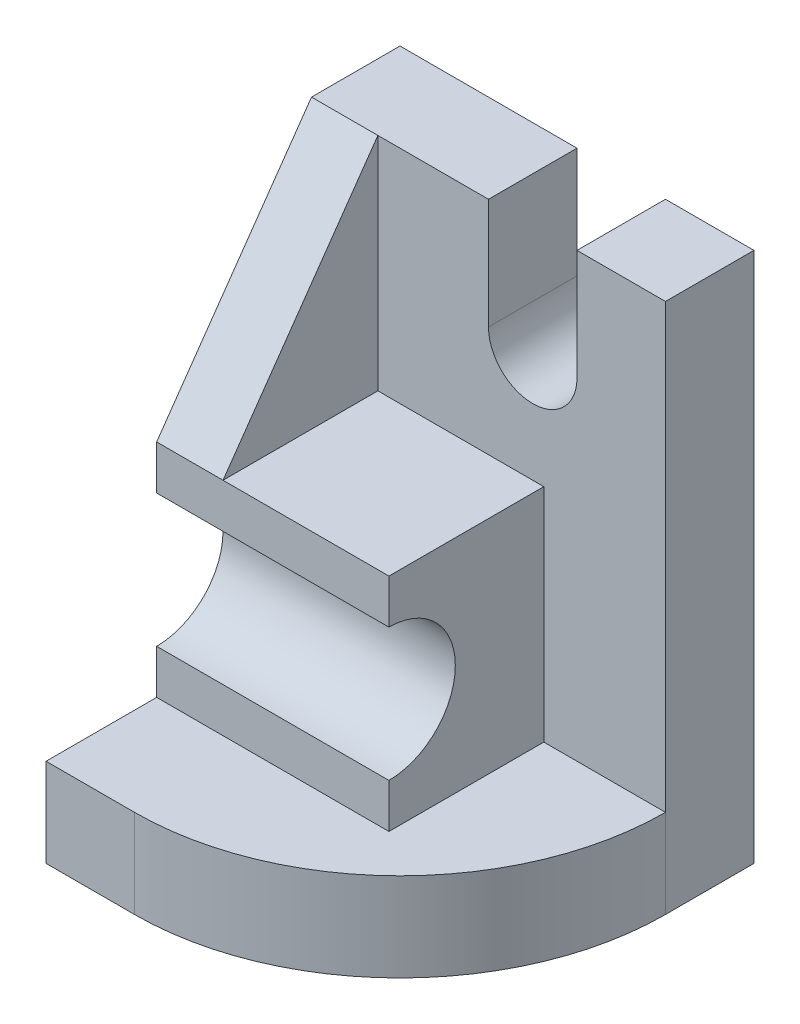
ISO-10303-21;
HEADER;
FILE_DESCRIPTION(('STEP AP214'),'2;1');
FILE_NAME('part.step','',(''),(''),'','','');
FILE_SCHEMA(('AUTOMOTIVE_DESIGN { 1 0 10303 214 1 1 1 1 }'));
ENDSEC;
DATA;
#1=APPLICATION_CONTEXT('core data for automotive mechanical design processes');
#2=APPLICATION_PROTOCOL_DEFINITION('international standard','automotive_design',2000,#1);
#3=PRODUCT_CONTEXT('',#1,'mechanical');
#4=PRODUCT('Part','Part','',(#3));
#5=PRODUCT_RELATED_PRODUCT_CATEGORY('part','',(#4));
#6=PRODUCT_DEFINITION_FORMATION('','',#4);
#7=PRODUCT_DEFINITION_CONTEXT('part definition',#1,'design');
#8=PRODUCT_DEFINITION('design','',#6,#7);
#9=PRODUCT_DEFINITION_SHAPE('','',#8);
#10=(LENGTH_UNIT() NAMED_UNIT(*) SI_UNIT(.MILLI.,.METRE.));
#11=(NAMED_UNIT(*) PLANE_ANGLE_UNIT() SI_UNIT($,.RADIAN.));
#12=(NAMED_UNIT(*) SI_UNIT($,.STERADIAN.) SOLID_ANGLE_UNIT());
#13=UNCERTAINTY_MEASURE_WITH_UNIT(LENGTH_MEASURE(1.E-05),#10,'distance_accuracy_value','');
#14=(GEOMETRIC_REPRESENTATION_CONTEXT(3) GLOBAL_UNCERTAINTY_ASSIGNED_CONTEXT((#13)) GLOBAL_UNIT_ASSIGNED_CONTEXT((#10,
#11,#12)) REPRESENTATION_CONTEXT('',''));
#15=CARTESIAN_POINT('',(0.,0.,0.));
#16=DIRECTION('',(0.,0.,1.));
#17=DIRECTION('',(1.,0.,0.));
#18=AXIS2_PLACEMENT_3D('',#15,#16,#17);
#19=CARTESIAN_POINT('',(0.,0.,44.));
#20=DIRECTION('',(0.,0.,-1.));
#21=DIRECTION('',(-1.,0.,0.));
#22=AXIS2_PLACEMENT_3D('',#19,#20,#21);
#23=PLANE('',#22);
#24=DIRECTION('',(0.,-1.,0.));
#25=VECTOR('',#24,1.);
#26=CARTESIAN_POINT('',(-64.,16.,44.));
#27=LINE('',#26,#25);
#28=CARTESIAN_POINT('',(-64.,56.,44.));
#29=VERTEX_POINT('',#28);
#30=CARTESIAN_POINT('',(-64.,48.,44.));
#31=VERTEX_POINT('',#30);
#32=EDGE_CURVE('E361',#29,#31,#27,.T.);
#33=ORIENTED_EDGE('',*,*,#32,.T.);
#34=DIRECTION('',(1.,0.,0.));
#35=VECTOR('',#34,1.);
#36=CARTESIAN_POINT('',(-64.001,48.,44.));
#37=LINE('',#36,#35);
#38=CARTESIAN_POINT('',(-22.,48.,44.));
#39=VERTEX_POINT('',#38);
#40=EDGE_CURVE('E355',#39,#31,#37,.F.);
#41=ORIENTED_EDGE('',*,*,#40,.F.);
#42=DIRECTION('',(0.,1.,0.));
#43=VECTOR('',#42,1.);
#44=CARTESIAN_POINT('',(-22.,16.,44.));
#45=LINE('',#44,#43);
#46=CARTESIAN_POINT('',(-22.,56.,44.));
#47=VERTEX_POINT('',#46);
#48=EDGE_CURVE('E183',#39,#47,#45,.T.);
#49=ORIENTED_EDGE('',*,*,#48,.T.);
#50=DIRECTION('',(-1.,0.,0.));
#51=VECTOR('',#50,1.);
#52=CARTESIAN_POINT('',(-64.,56.,44.));
#53=LINE('',#52,#51);
#54=CARTESIAN_POINT('',(-52.,56.,44.));
#55=VERTEX_POINT('',#54);
#56=EDGE_CURVE('E179',#47,#55,#53,.T.);
#57=ORIENTED_EDGE('',*,*,#56,.T.);
#58=DIRECTION('',(-1.,0.,0.));
#59=VECTOR('',#58,1.);
#60=CARTESIAN_POINT('',(-52.,56.,44.));
#61=LINE('',#60,#59);
#62=EDGE_CURVE('E155',#55,#29,#61,.T.);
#63=ORIENTED_EDGE('',*,*,#62,.T.);
#64=EDGE_LOOP('',(#33,#41,#49,#57,#63));
#65=FACE_BOUND('',#64,.T.);
#66=ADVANCED_FACE('F39',(#65),#23,.F.);
#67=CARTESIAN_POINT('',(0.,0.,16.));
#68=DIRECTION('',(0.,0.,-1.));
#69=DIRECTION('',(-1.,0.,0.));
#70=AXIS2_PLACEMENT_3D('',#67,#68,#69);
#71=PLANE('',#70);
#72=DIRECTION('',(-1.,0.,0.));
#73=VECTOR('',#72,1.);
#74=CARTESIAN_POINT('',(0.,96.,16.));
#75=LINE('',#74,#73);
#76=CARTESIAN_POINT('',(-32.,96.,16.));
#77=VERTEX_POINT('',#76);
#78=CARTESIAN_POINT('',(-52.,96.,16.));
#79=VERTEX_POINT('',#78);
#80=EDGE_CURVE('E253',#77,#79,#75,.T.);
#81=ORIENTED_EDGE('',*,*,#80,.T.);
#82=DIRECTION('',(0.,-1.,0.));
#83=VECTOR('',#82,1.);
#84=CARTESIAN_POINT('',(-52.,56.,16.));
#85=LINE('',#84,#83);
#86=CARTESIAN_POINT('',(-52.,56.,16.));
#87=VERTEX_POINT('',#86);
#88=EDGE_CURVE('E167',#79,#87,#85,.T.);
#89=ORIENTED_EDGE('',*,*,#88,.T.);
#90=DIRECTION('',(-1.,0.,0.));
#91=VECTOR('',#90,1.);
#92=CARTESIAN_POINT('',(-64.,56.,16.));
#93=LINE('',#92,#91);
#94=CARTESIAN_POINT('',(-22.,56.,16.));
#95=VERTEX_POINT('',#94);
#96=EDGE_CURVE('E62',#95,#87,#93,.T.);
#97=ORIENTED_EDGE('',*,*,#96,.F.);
#98=DIRECTION('',(0.,1.,0.));
#99=VECTOR('',#98,1.);
#100=CARTESIAN_POINT('',(-22.,16.,16.));
#101=LINE('',#100,#99);
#102=CARTESIAN_POINT('',(-22.,16.,16.));
#103=VERTEX_POINT('',#102);
#104=EDGE_CURVE('E194',#103,#95,#101,.T.);
#105=ORIENTED_EDGE('',*,*,#104,.F.);
#106=DIRECTION('',(-1.,0.,0.));
#107=VECTOR('',#106,1.);
#108=CARTESIAN_POINT('',(0.,16.,16.));
#109=LINE('',#108,#107);
#110=CARTESIAN_POINT('',(0.,16.,16.));
#111=VERTEX_POINT('',#110);
#112=EDGE_CURVE('E219',#111,#103,#109,.T.);
#113=ORIENTED_EDGE('',*,*,#112,.F.);
#114=DIRECTION('',(0.,1.,0.));
#115=VECTOR('',#114,1.);
#116=CARTESIAN_POINT('',(0.,0.,16.));
#117=LINE('',#116,#115);
#118=CARTESIAN_POINT('',(0.,96.,16.));
#119=VERTEX_POINT('',#118);
#120=EDGE_CURVE('E254',#111,#119,#117,.T.);
#121=ORIENTED_EDGE('',*,*,#120,.T.);
#122=CARTESIAN_POINT('',(-16.,96.,16.));
#123=VERTEX_POINT('',#122);
#124=EDGE_CURVE('E255',#119,#123,#75,.T.);
#125=ORIENTED_EDGE('',*,*,#124,.T.);
#126=DIRECTION('',(0.,1.,0.));
#127=VECTOR('',#126,1.);
#128=CARTESIAN_POINT('',(-16.,96.,16.));
#129=LINE('',#128,#127);
#130=CARTESIAN_POINT('',(-16.,76.,16.));
#131=VERTEX_POINT('',#130);
#132=EDGE_CURVE('E228',#131,#123,#129,.T.);
#133=ORIENTED_EDGE('',*,*,#132,.F.);
#134=CARTESIAN_POINT('',(-24.,76.,16.));
#135=DIRECTION('',(0.,0.,1.));
#136=DIRECTION('',(1.,0.,0.));
#137=AXIS2_PLACEMENT_3D('',#134,#135,#136);
#138=CIRCLE('',#137,8.);
#139=CARTESIAN_POINT('',(-32.,76.,16.));
#140=VERTEX_POINT('',#139);
#141=EDGE_CURVE('E237',#140,#131,#138,.T.);
#142=ORIENTED_EDGE('',*,*,#141,.F.);
#143=DIRECTION('',(0.,-1.,0.));
#144=VECTOR('',#143,1.);
#145=CARTESIAN_POINT('',(-32.,96.,16.));
#146=LINE('',#145,#144);
#147=EDGE_CURVE('E223',#77,#140,#146,.T.);
#148=ORIENTED_EDGE('',*,*,#147,.F.);
#149=EDGE_LOOP('',(#81,#89,#97,#105,#113,#121,#125,#133,#142,#148));
#150=FACE_BOUND('',#149,.T.);
#151=ADVANCED_FACE('F289',(#150),#71,.F.);
#152=CARTESIAN_POINT('',(-48.,16.,16.));
#153=DIRECTION('',(0.,-1.,0.));
#154=DIRECTION('',(0.,0.,-1.));
#155=AXIS2_PLACEMENT_3D('',#152,#153,#154);
#156=PLANE('',#155);
#157=DIRECTION('',(0.,0.,-1.));
#158=VECTOR('',#157,1.);
#159=CARTESIAN_POINT('',(-22.,16.,44.));
#160=LINE('',#159,#158);
#161=CARTESIAN_POINT('',(-22.,16.,44.));
#162=VERTEX_POINT('',#161);
#163=EDGE_CURVE('E188',#162,#103,#160,.T.);
#164=ORIENTED_EDGE('',*,*,#163,.F.);
#165=DIRECTION('',(1.,0.,0.));
#166=VECTOR('',#165,1.);
#167=CARTESIAN_POINT('',(-64.,16.,44.));
#168=LINE('',#167,#166);
#169=CARTESIAN_POINT('',(-64.,16.,44.));
#170=VERTEX_POINT('',#169);
#171=EDGE_CURVE('E351',#170,#162,#168,.T.);
#172=ORIENTED_EDGE('',*,*,#171,.F.);
#173=DIRECTION('',(0.,0.,-1.));
#174=VECTOR('',#173,1.);
#175=CARTESIAN_POINT('',(-64.,16.,0.));
#176=LINE('',#175,#174);
#177=CARTESIAN_POINT('',(-64.,16.,64.));
#178=VERTEX_POINT('',#177);
#179=EDGE_CURVE('E201',#178,#170,#176,.T.);
#180=ORIENTED_EDGE('',*,*,#179,.F.);
#181=DIRECTION('',(-1.,0.,0.));
#182=VECTOR('',#181,1.);
#183=CARTESIAN_POINT('',(-64.,16.,64.));
#184=LINE('',#183,#182);
#185=CARTESIAN_POINT('',(-48.,16.,64.));
#186=VERTEX_POINT('',#185);
#187=EDGE_CURVE('E208',#186,#178,#184,.T.);
#188=ORIENTED_EDGE('',*,*,#187,.F.);
#189=CARTESIAN_POINT('',(-48.,16.,16.));
#190=DIRECTION('',(0.,-1.,0.));
#191=DIRECTION('',(0.,0.,-1.));
#192=AXIS2_PLACEMENT_3D('',#189,#190,#191);
#193=CIRCLE('',#192,48.);
#194=EDGE_CURVE('E204',#111,#186,#193,.T.);
#195=ORIENTED_EDGE('',*,*,#194,.F.);
#196=ORIENTED_EDGE('',*,*,#112,.T.);
#197=EDGE_LOOP('',(#164,#172,#180,#188,#195,#196));
#198=FACE_BOUND('',#197,.T.);
#199=ADVANCED_FACE('F299',(#198),#156,.F.);
#200=CARTESIAN_POINT('',(0.,96.,16.));
#201=DIRECTION('',(0.,-1.,0.));
#202=DIRECTION('',(0.,0.,-1.));
#203=AXIS2_PLACEMENT_3D('',#200,#201,#202);
#204=PLANE('',#203);
#205=DIRECTION('',(-1.,0.,0.));
#206=VECTOR('',#205,1.);
#207=CARTESIAN_POINT('',(0.,96.,0.));
#208=LINE('',#207,#206);
#209=CARTESIAN_POINT('',(0.,96.,0.));
#210=VERTEX_POINT('',#209);
#211=CARTESIAN_POINT('',(-16.,96.,0.));
#212=VERTEX_POINT('',#211);
#213=EDGE_CURVE('E264',#210,#212,#208,.T.);
#214=ORIENTED_EDGE('',*,*,#213,.T.);
#215=DIRECTION('',(0.,0.,1.));
#216=VECTOR('',#215,1.);
#217=CARTESIAN_POINT('',(-16.,96.,0.));
#218=LINE('',#217,#216);
#219=EDGE_CURVE('E241',#212,#123,#218,.T.);
#220=ORIENTED_EDGE('',*,*,#219,.T.);
#221=ORIENTED_EDGE('',*,*,#124,.F.);
#222=DIRECTION('',(0.,0.,-1.));
#223=VECTOR('',#222,1.);
#224=CARTESIAN_POINT('',(0.,96.,16.));
#225=LINE('',#224,#223);
#226=EDGE_CURVE('E47',#119,#210,#225,.T.);
#227=ORIENTED_EDGE('',*,*,#226,.T.);
#228=EDGE_LOOP('',(#214,#220,#221,#227));
#229=FACE_BOUND('',#228,.T.);
#230=ADVANCED_FACE('F278',(#229),#204,.F.);
#231=CARTESIAN_POINT('',(0.,0.,16.));
#232=DIRECTION('',(0.,1.,0.));
#233=DIRECTION('',(0.,0.,1.));
#234=AXIS2_PLACEMENT_3D('',#231,#232,#233);
#235=PLANE('',#234);
#236=DIRECTION('',(1.,0.,0.));
#237=VECTOR('',#236,1.);
#238=CARTESIAN_POINT('',(0.,0.,0.));
#239=LINE('',#238,#237);
#240=CARTESIAN_POINT('',(-64.,0.,0.));
#241=VERTEX_POINT('',#240);
#242=CARTESIAN_POINT('',(0.,0.,0.));
#243=VERTEX_POINT('',#242);
#244=EDGE_CURVE('E244',#241,#243,#239,.T.);
#245=ORIENTED_EDGE('',*,*,#244,.T.);
#246=DIRECTION('',(0.,0.,-1.));
#247=VECTOR('',#246,1.);
#248=CARTESIAN_POINT('',(0.,0.,16.));
#249=LINE('',#248,#247);
#250=CARTESIAN_POINT('',(0.,0.,16.));
#251=VERTEX_POINT('',#250);
#252=EDGE_CURVE('E11',#251,#243,#249,.T.);
#253=ORIENTED_EDGE('',*,*,#252,.F.);
#254=CARTESIAN_POINT('',(-48.,0.,16.));
#255=DIRECTION('',(0.,-1.,0.));
#256=DIRECTION('',(0.,0.,-1.));
#257=AXIS2_PLACEMENT_3D('',#254,#255,#256);
#258=CIRCLE('',#257,48.);
#259=CARTESIAN_POINT('',(-48.,0.,64.));
#260=VERTEX_POINT('',#259);
#261=EDGE_CURVE('E200',#251,#260,#258,.T.);
#262=ORIENTED_EDGE('',*,*,#261,.T.);
#263=DIRECTION('',(-1.,0.,0.));
#264=VECTOR('',#263,1.);
#265=CARTESIAN_POINT('',(-64.,0.,64.));
#266=LINE('',#265,#264);
#267=CARTESIAN_POINT('',(-64.,0.,64.));
#268=VERTEX_POINT('',#267);
#269=EDGE_CURVE('E205',#260,#268,#266,.T.);
#270=ORIENTED_EDGE('',*,*,#269,.T.);
#271=DIRECTION('',(0.,0.,-1.));
#272=VECTOR('',#271,1.);
#273=CARTESIAN_POINT('',(-64.,0.,16.));
#274=LINE('',#273,#272);
#275=EDGE_CURVE('E258',#268,#241,#274,.T.);
#276=ORIENTED_EDGE('',*,*,#275,.T.);
#277=EDGE_LOOP('',(#245,#253,#262,#270,#276));
#278=FACE_BOUND('',#277,.T.);
#279=ADVANCED_FACE('F41',(#278),#235,.F.);
#280=CARTESIAN_POINT('',(0.,0.,16.));
#281=DIRECTION('',(-1.,0.,0.));
#282=DIRECTION('',(0.,0.,1.));
#283=AXIS2_PLACEMENT_3D('',#280,#281,#282);
#284=PLANE('',#283);
#285=DIRECTION('',(0.,1.,0.));
#286=VECTOR('',#285,1.);
#287=CARTESIAN_POINT('',(0.,0.,0.));
#288=LINE('',#287,#286);
#289=EDGE_CURVE('E261',#243,#210,#288,.T.);
#290=ORIENTED_EDGE('',*,*,#289,.T.);
#291=ORIENTED_EDGE('',*,*,#226,.F.);
#292=ORIENTED_EDGE('',*,*,#120,.F.);
#293=EDGE_CURVE('E250',#251,#111,#117,.T.);
#294=ORIENTED_EDGE('',*,*,#293,.F.);
#295=ORIENTED_EDGE('',*,*,#252,.T.);
#296=EDGE_LOOP('',(#290,#291,#292,#294,#295));
#297=FACE_BOUND('',#296,.T.);
#298=ADVANCED_FACE('F292',(#297),#284,.F.);
#299=ORIENTED_EDGE('',*,*,#80,.F.);
#300=DIRECTION('',(0.,0.,1.));
#301=VECTOR('',#300,1.);
#302=CARTESIAN_POINT('',(-32.,96.,0.));
#303=LINE('',#302,#301);
#304=CARTESIAN_POINT('',(-32.,96.,0.));
#305=VERTEX_POINT('',#304);
#306=EDGE_CURVE('E234',#305,#77,#303,.T.);
#307=ORIENTED_EDGE('',*,*,#306,.F.);
#308=CARTESIAN_POINT('',(-64.,96.,0.));
#309=VERTEX_POINT('',#308);
#310=EDGE_CURVE('E263',#305,#309,#208,.T.);
#311=ORIENTED_EDGE('',*,*,#310,.T.);
#312=DIRECTION('',(0.,0.,-1.));
#313=VECTOR('',#312,1.);
#314=CARTESIAN_POINT('',(-64.,96.,16.));
#315=LINE('',#314,#313);
#316=CARTESIAN_POINT('',(-64.,96.,16.));
#317=VERTEX_POINT('',#316);
#318=EDGE_CURVE('E271',#317,#309,#315,.T.);
#319=ORIENTED_EDGE('',*,*,#318,.F.);
#320=DIRECTION('',(-1.,0.,0.));
#321=VECTOR('',#320,1.);
#322=CARTESIAN_POINT('',(-52.,96.,16.));
#323=LINE('',#322,#321);
#324=EDGE_CURVE('E166',#79,#317,#323,.T.);
#325=ORIENTED_EDGE('',*,*,#324,.F.);
#326=EDGE_LOOP('',(#299,#307,#311,#319,#325));
#327=FACE_BOUND('',#326,.T.);
#328=ADVANCED_FACE('F314',(#327),#204,.F.);
#329=CARTESIAN_POINT('',(-64.,0.,16.));
#330=DIRECTION('',(1.,0.,0.));
#331=DIRECTION('',(0.,0.,-1.));
#332=AXIS2_PLACEMENT_3D('',#329,#330,#331);
#333=PLANE('',#332);
#334=CARTESIAN_POINT('',(-64.,24.,44.));
#335=VERTEX_POINT('',#334);
#336=EDGE_CURVE('E196',#335,#170,#27,.T.);
#337=ORIENTED_EDGE('',*,*,#336,.F.);
#338=CARTESIAN_POINT('',(-64.,36.,44.));
#339=DIRECTION('',(1.,0.,0.));
#340=DIRECTION('',(0.,0.,-1.));
#341=AXIS2_PLACEMENT_3D('',#338,#339,#340);
#342=CIRCLE('',#341,12.);
#343=EDGE_CURVE('E54',#31,#335,#342,.F.);
#344=ORIENTED_EDGE('',*,*,#343,.F.);
#345=ORIENTED_EDGE('',*,*,#32,.F.);
#346=DIRECTION('',(0.,0.819231920519041,-0.573462344363328));
#347=VECTOR('',#346,1.);
#348=CARTESIAN_POINT('',(-64.,56.,44.));
#349=LINE('',#348,#347);
#350=EDGE_CURVE('E161',#29,#317,#349,.T.);
#351=ORIENTED_EDGE('',*,*,#350,.T.);
#352=ORIENTED_EDGE('',*,*,#318,.T.);
#353=DIRECTION('',(0.,-1.,0.));
#354=VECTOR('',#353,1.);
#355=CARTESIAN_POINT('',(-64.,0.,0.));
#356=LINE('',#355,#354);
#357=EDGE_CURVE('E267',#309,#241,#356,.T.);
#358=ORIENTED_EDGE('',*,*,#357,.T.);
#359=ORIENTED_EDGE('',*,*,#275,.F.);
#360=DIRECTION('',(0.,-1.,0.));
#361=VECTOR('',#360,1.);
#362=CARTESIAN_POINT('',(-64.,16.,64.));
#363=LINE('',#362,#361);
#364=EDGE_CURVE('E216',#178,#268,#363,.T.);
#365=ORIENTED_EDGE('',*,*,#364,.F.);
#366=ORIENTED_EDGE('',*,*,#179,.T.);
#367=EDGE_LOOP('',(#337,#344,#345,#351,#352,#358,#359,#365,#366));
#368=FACE_BOUND('',#367,.T.);
#369=ADVANCED_FACE('F310',(#368),#333,.F.);
#370=CARTESIAN_POINT('',(0.,0.,0.));
#371=DIRECTION('',(0.,0.,-1.));
#372=DIRECTION('',(-1.,0.,0.));
#373=AXIS2_PLACEMENT_3D('',#370,#371,#372);
#374=PLANE('',#373);
#375=ORIENTED_EDGE('',*,*,#244,.F.);
#376=ORIENTED_EDGE('',*,*,#357,.F.);
#377=ORIENTED_EDGE('',*,*,#310,.F.);
#378=DIRECTION('',(0.,-1.,0.));
#379=VECTOR('',#378,1.);
#380=CARTESIAN_POINT('',(-32.,96.,0.));
#381=LINE('',#380,#379);
#382=CARTESIAN_POINT('',(-32.,76.,0.));
#383=VERTEX_POINT('',#382);
#384=EDGE_CURVE('E224',#305,#383,#381,.T.);
#385=ORIENTED_EDGE('',*,*,#384,.T.);
#386=CARTESIAN_POINT('',(-24.,76.,0.));
#387=DIRECTION('',(0.,0.,1.));
#388=DIRECTION('',(1.,0.,0.));
#389=AXIS2_PLACEMENT_3D('',#386,#387,#388);
#390=CIRCLE('',#389,8.);
#391=CARTESIAN_POINT('',(-16.,76.,0.));
#392=VERTEX_POINT('',#391);
#393=EDGE_CURVE('E227',#383,#392,#390,.T.);
#394=ORIENTED_EDGE('',*,*,#393,.T.);
#395=DIRECTION('',(0.,1.,0.));
#396=VECTOR('',#395,1.);
#397=CARTESIAN_POINT('',(-16.,96.,0.));
#398=LINE('',#397,#396);
#399=EDGE_CURVE('E231',#392,#212,#398,.T.);
#400=ORIENTED_EDGE('',*,*,#399,.T.);
#401=ORIENTED_EDGE('',*,*,#213,.F.);
#402=ORIENTED_EDGE('',*,*,#289,.F.);
#403=EDGE_LOOP('',(#375,#376,#377,#385,#394,#400,#401,#402));
#404=FACE_BOUND('',#403,.T.);
#405=ADVANCED_FACE('F283',(#404),#374,.T.);
#406=CARTESIAN_POINT('',(-16.,96.,0.));
#407=DIRECTION('',(1.,0.,0.));
#408=DIRECTION('',(0.,1.,0.));
#409=AXIS2_PLACEMENT_3D('',#406,#407,#408);
#410=PLANE('',#409);
#411=ORIENTED_EDGE('',*,*,#132,.T.);
#412=ORIENTED_EDGE('',*,*,#219,.F.);
#413=ORIENTED_EDGE('',*,*,#399,.F.);
#414=DIRECTION('',(0.,0.,1.));
#415=VECTOR('',#414,1.);
#416=CARTESIAN_POINT('',(-16.,76.,0.));
#417=LINE('',#416,#415);
#418=EDGE_CURVE('E245',#392,#131,#417,.T.);
#419=ORIENTED_EDGE('',*,*,#418,.T.);
#420=EDGE_LOOP('',(#411,#412,#413,#419));
#421=FACE_BOUND('',#420,.T.);
#422=ADVANCED_FACE('F286',(#421),#410,.F.);
#423=CARTESIAN_POINT('',(-24.,76.,0.));
#424=DIRECTION('',(0.,0.,1.));
#425=DIRECTION('',(1.,0.,0.));
#426=AXIS2_PLACEMENT_3D('',#423,#424,#425);
#427=CYLINDRICAL_SURFACE('',#426,8.);
#428=ORIENTED_EDGE('',*,*,#141,.T.);
#429=ORIENTED_EDGE('',*,*,#418,.F.);
#430=ORIENTED_EDGE('',*,*,#393,.F.);
#431=DIRECTION('',(0.,0.,1.));
#432=VECTOR('',#431,1.);
#433=CARTESIAN_POINT('',(-32.,76.,0.));
#434=LINE('',#433,#432);
#435=EDGE_CURVE('E247',#383,#140,#434,.T.);
#436=ORIENTED_EDGE('',*,*,#435,.T.);
#437=EDGE_LOOP('',(#428,#429,#430,#436));
#438=FACE_BOUND('',#437,.T.);
#439=ADVANCED_FACE('F321',(#438),#427,.F.);
#440=CARTESIAN_POINT('',(-32.,96.,0.));
#441=DIRECTION('',(-1.,0.,0.));
#442=DIRECTION('',(0.,0.,1.));
#443=AXIS2_PLACEMENT_3D('',#440,#441,#442);
#444=PLANE('',#443);
#445=ORIENTED_EDGE('',*,*,#147,.T.);
#446=ORIENTED_EDGE('',*,*,#435,.F.);
#447=ORIENTED_EDGE('',*,*,#384,.F.);
#448=ORIENTED_EDGE('',*,*,#306,.T.);
#449=EDGE_LOOP('',(#445,#446,#447,#448));
#450=FACE_BOUND('',#449,.T.);
#451=ADVANCED_FACE('F318',(#450),#444,.F.);
#452=CARTESIAN_POINT('',(-64.,16.,64.));
#453=DIRECTION('',(0.,0.,1.));
#454=DIRECTION('',(1.,0.,0.));
#455=AXIS2_PLACEMENT_3D('',#452,#453,#454);
#456=PLANE('',#455);
#457=ORIENTED_EDGE('',*,*,#269,.F.);
#458=DIRECTION('',(0.,-1.,0.));
#459=VECTOR('',#458,1.);
#460=CARTESIAN_POINT('',(-48.,16.,64.));
#461=LINE('',#460,#459);
#462=EDGE_CURVE('E211',#186,#260,#461,.T.);
#463=ORIENTED_EDGE('',*,*,#462,.F.);
#464=ORIENTED_EDGE('',*,*,#187,.T.);
#465=ORIENTED_EDGE('',*,*,#364,.T.);
#466=EDGE_LOOP('',(#457,#463,#464,#465));
#467=FACE_BOUND('',#466,.T.);
#468=ADVANCED_FACE('F304',(#467),#456,.T.);
#469=CARTESIAN_POINT('',(-48.,16.,16.));
#470=DIRECTION('',(0.,-1.,0.));
#471=DIRECTION('',(0.,0.,-1.));
#472=AXIS2_PLACEMENT_3D('',#469,#470,#471);
#473=CYLINDRICAL_SURFACE('',#472,48.);
#474=ORIENTED_EDGE('',*,*,#261,.F.);
#475=ORIENTED_EDGE('',*,*,#293,.T.);
#476=ORIENTED_EDGE('',*,*,#194,.T.);
#477=ORIENTED_EDGE('',*,*,#462,.T.);
#478=EDGE_LOOP('',(#474,#475,#476,#477));
#479=FACE_BOUND('',#478,.T.);
#480=ADVANCED_FACE('F296',(#479),#473,.T.);
#481=CARTESIAN_POINT('',(-22.,16.,44.));
#482=DIRECTION('',(-1.,0.,0.));
#483=DIRECTION('',(0.,0.,1.));
#484=AXIS2_PLACEMENT_3D('',#481,#482,#483);
#485=PLANE('',#484);
#486=ORIENTED_EDGE('',*,*,#48,.F.);
#487=CARTESIAN_POINT('',(-22.,36.,44.));
#488=DIRECTION('',(1.,0.,0.));
#489=DIRECTION('',(0.,0.,-1.));
#490=AXIS2_PLACEMENT_3D('',#487,#488,#489);
#491=CIRCLE('',#490,12.);
#492=CARTESIAN_POINT('',(-22.,24.,44.));
#493=VERTEX_POINT('',#492);
#494=EDGE_CURVE('E354',#493,#39,#491,.T.);
#495=ORIENTED_EDGE('',*,*,#494,.F.);
#496=EDGE_CURVE('E186',#162,#493,#45,.T.);
#497=ORIENTED_EDGE('',*,*,#496,.F.);
#498=ORIENTED_EDGE('',*,*,#163,.T.);
#499=ORIENTED_EDGE('',*,*,#104,.T.);
#500=DIRECTION('',(0.,0.,-1.));
#501=VECTOR('',#500,1.);
#502=CARTESIAN_POINT('',(-22.,56.,44.));
#503=LINE('',#502,#501);
#504=EDGE_CURVE('E185',#47,#95,#503,.T.);
#505=ORIENTED_EDGE('',*,*,#504,.F.);
#506=EDGE_LOOP('',(#486,#495,#497,#498,#499,#505));
#507=FACE_BOUND('',#506,.T.);
#508=ADVANCED_FACE('F347',(#507),#485,.F.);
#509=CARTESIAN_POINT('',(-64.,56.,44.));
#510=DIRECTION('',(0.,-1.,0.));
#511=DIRECTION('',(0.,0.,-1.));
#512=AXIS2_PLACEMENT_3D('',#509,#510,#511);
#513=PLANE('',#512);
#514=ORIENTED_EDGE('',*,*,#96,.T.);
#515=DIRECTION('',(0.,0.,1.));
#516=VECTOR('',#515,1.);
#517=CARTESIAN_POINT('',(-52.,56.,44.));
#518=LINE('',#517,#516);
#519=EDGE_CURVE('E172',#87,#55,#518,.T.);
#520=ORIENTED_EDGE('',*,*,#519,.T.);
#521=ORIENTED_EDGE('',*,*,#56,.F.);
#522=ORIENTED_EDGE('',*,*,#504,.T.);
#523=EDGE_LOOP('',(#514,#520,#521,#522));
#524=FACE_BOUND('',#523,.T.);
#525=ADVANCED_FACE('F177',(#524),#513,.F.);
#526=ORIENTED_EDGE('',*,*,#496,.T.);
#527=DIRECTION('',(1.,0.,0.));
#528=VECTOR('',#527,1.);
#529=CARTESIAN_POINT('',(-64.001,24.,44.));
#530=LINE('',#529,#528);
#531=EDGE_CURVE('E350',#335,#493,#530,.T.);
#532=ORIENTED_EDGE('',*,*,#531,.F.);
#533=ORIENTED_EDGE('',*,*,#336,.T.);
#534=ORIENTED_EDGE('',*,*,#171,.T.);
#535=EDGE_LOOP('',(#526,#532,#533,#534));
#536=FACE_BOUND('',#535,.T.);
#537=ADVANCED_FACE('F332',(#536),#23,.F.);
#538=CARTESIAN_POINT('',(-64.001,36.,44.));
#539=DIRECTION('',(1.,0.,0.));
#540=DIRECTION('',(0.,0.,-1.));
#541=AXIS2_PLACEMENT_3D('',#538,#539,#540);
#542=CYLINDRICAL_SURFACE('',#541,12.);
#543=ORIENTED_EDGE('',*,*,#40,.T.);
#544=ORIENTED_EDGE('',*,*,#343,.T.);
#545=ORIENTED_EDGE('',*,*,#531,.T.);
#546=ORIENTED_EDGE('',*,*,#494,.T.);
#547=EDGE_LOOP('',(#543,#544,#545,#546));
#548=FACE_BOUND('',#547,.T.);
#549=ADVANCED_FACE('F341',(#548),#542,.F.);
#550=CARTESIAN_POINT('',(-52.,56.,44.));
#551=DIRECTION('',(0.,0.573462344363328,0.81923192051904));
#552=DIRECTION('',(0.,-0.819231920519041,0.573462344363328));
#553=AXIS2_PLACEMENT_3D('',#550,#551,#552);
#554=PLANE('',#553);
#555=ORIENTED_EDGE('',*,*,#350,.F.);
#556=ORIENTED_EDGE('',*,*,#62,.F.);
#557=DIRECTION('',(0.,0.819231920519041,-0.573462344363328));
#558=VECTOR('',#557,1.);
#559=CARTESIAN_POINT('',(-52.,56.,44.));
#560=LINE('',#559,#558);
#561=EDGE_CURVE('E158',#55,#79,#560,.T.);
#562=ORIENTED_EDGE('',*,*,#561,.T.);
#563=ORIENTED_EDGE('',*,*,#324,.T.);
#564=EDGE_LOOP('',(#555,#556,#562,#563));
#565=FACE_BOUND('',#564,.T.);
#566=ADVANCED_FACE('F157',(#565),#554,.T.);
#567=CARTESIAN_POINT('',(-52.,0.,0.));
#568=DIRECTION('',(1.,0.,0.));
#569=DIRECTION('',(0.,0.,-1.));
#570=AXIS2_PLACEMENT_3D('',#567,#568,#569);
#571=PLANE('',#570);
#572=ORIENTED_EDGE('',*,*,#519,.F.);
#573=ORIENTED_EDGE('',*,*,#88,.F.);
#574=ORIENTED_EDGE('',*,*,#561,.F.);
#575=EDGE_LOOP('',(#572,#573,#574));
#576=FACE_BOUND('',#575,.T.);
#577=ADVANCED_FACE('F171',(#576),#571,.T.);
#578=CLOSED_SHELL('',(#66,#151,#199,#230,#279,#298,#328,#369,#405,#422,#439,#451,#468,#480,#508,
#525,#537,#549,#566,#577));
#579=MANIFOLD_SOLID_BREP('B2',#578);
#580=ADVANCED_BREP_SHAPE_REPRESENTATION('',(#18,#579),#14);
#581=SHAPE_DEFINITION_REPRESENTATION(#9,#580);
ENDSEC;
END-ISO-10303-21;
